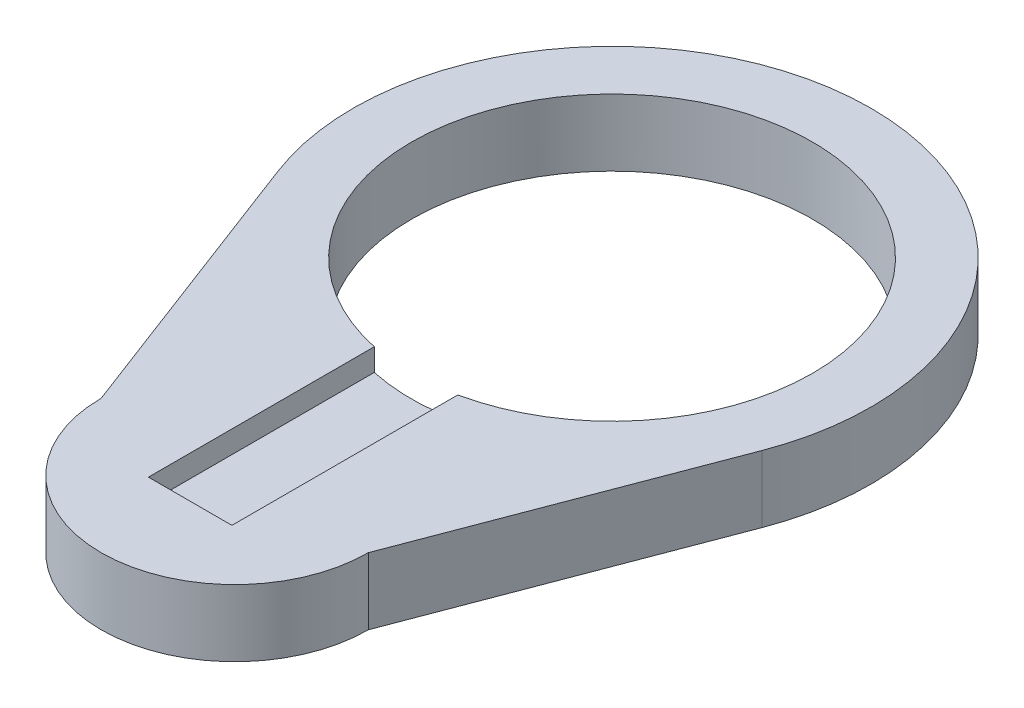
ISO-10303-21;
HEADER;
FILE_DESCRIPTION(('STEP AP214'),'2;1');
FILE_NAME('part.step','',(''),(''),'','','');
FILE_SCHEMA(('AUTOMOTIVE_DESIGN { 1 0 10303 214 1 1 1 1 }'));
ENDSEC;
DATA;
#1=APPLICATION_CONTEXT('core data for automotive mechanical design processes');
#2=APPLICATION_PROTOCOL_DEFINITION('international standard','automotive_design',2000,#1);
#3=PRODUCT_CONTEXT('',#1,'mechanical');
#4=PRODUCT('Part','Part','',(#3));
#5=PRODUCT_RELATED_PRODUCT_CATEGORY('part','',(#4));
#6=PRODUCT_DEFINITION_FORMATION('','',#4);
#7=PRODUCT_DEFINITION_CONTEXT('part definition',#1,'design');
#8=PRODUCT_DEFINITION('design','',#6,#7);
#9=PRODUCT_DEFINITION_SHAPE('','',#8);
#10=(LENGTH_UNIT() NAMED_UNIT(*) SI_UNIT(.MILLI.,.METRE.));
#11=(NAMED_UNIT(*) PLANE_ANGLE_UNIT() SI_UNIT($,.RADIAN.));
#12=(NAMED_UNIT(*) SI_UNIT($,.STERADIAN.) SOLID_ANGLE_UNIT());
#13=UNCERTAINTY_MEASURE_WITH_UNIT(LENGTH_MEASURE(1.E-05),#10,'distance_accuracy_value','');
#14=(GEOMETRIC_REPRESENTATION_CONTEXT(3) GLOBAL_UNCERTAINTY_ASSIGNED_CONTEXT((#13)) GLOBAL_UNIT_ASSIGNED_CONTEXT((#10,
#11,#12)) REPRESENTATION_CONTEXT('',''));
#15=CARTESIAN_POINT('',(0.,0.,0.));
#16=DIRECTION('',(0.,0.,1.));
#17=DIRECTION('',(1.,0.,0.));
#18=AXIS2_PLACEMENT_3D('',#15,#16,#17);
#19=CARTESIAN_POINT('',(0.,6.,-33.89));
#20=DIRECTION('',(0.,1.,0.));
#21=DIRECTION('',(0.,0.,1.));
#22=AXIS2_PLACEMENT_3D('',#19,#20,#21);
#23=PLANE('',#22);
#24=DIRECTION('',(0.,0.,1.));
#25=VECTOR('',#24,1.);
#26=CARTESIAN_POINT('',(-3.75,6.,-17.));
#27=LINE('',#26,#25);
#28=CARTESIAN_POINT('',(-3.75,6.,-16.2849581085418));
#29=VERTEX_POINT('',#28);
#30=CARTESIAN_POINT('',(-3.75,6.,4.));
#31=VERTEX_POINT('',#30);
#32=EDGE_CURVE('E131',#29,#31,#27,.T.);
#33=ORIENTED_EDGE('',*,*,#32,.F.);
#34=CARTESIAN_POINT('',(0.,6.,-33.89));
#35=DIRECTION('',(0.,1.,0.));
#36=DIRECTION('',(0.,0.,1.));
#37=AXIS2_PLACEMENT_3D('',#34,#35,#36);
#38=CIRCLE('',#37,18.);
#39=CARTESIAN_POINT('',(3.75,6.,-16.2849581085418));
#40=VERTEX_POINT('',#39);
#41=EDGE_CURVE('E154',#40,#29,#38,.T.);
#42=ORIENTED_EDGE('',*,*,#41,.F.);
#43=DIRECTION('',(0.,0.,-1.));
#44=VECTOR('',#43,1.);
#45=CARTESIAN_POINT('',(3.75,6.,-17.));
#46=LINE('',#45,#44);
#47=CARTESIAN_POINT('',(3.75,6.,4.));
#48=VERTEX_POINT('',#47);
#49=EDGE_CURVE('E125',#48,#40,#46,.T.);
#50=ORIENTED_EDGE('',*,*,#49,.F.);
#51=DIRECTION('',(1.,0.,0.));
#52=VECTOR('',#51,1.);
#53=CARTESIAN_POINT('',(-3.75,6.,4.));
#54=LINE('',#53,#52);
#55=EDGE_CURVE('E146',#31,#48,#54,.T.);
#56=ORIENTED_EDGE('',*,*,#55,.F.);
#57=EDGE_LOOP('',(#33,#42,#50,#56));
#58=FACE_BOUND('',#57,.T.);
#59=CARTESIAN_POINT('',(0.,6.,-33.89));
#60=DIRECTION('',(0.,1.,0.));
#61=DIRECTION('',(0.,0.,1.));
#62=AXIS2_PLACEMENT_3D('',#59,#60,#61);
#63=CIRCLE('',#62,23.25);
#64=CARTESIAN_POINT('',(21.7354445195078,6.,-25.6357313140777));
#65=VERTEX_POINT('',#64);
#66=CARTESIAN_POINT('',(-21.7354445195078,6.,-25.6357313140777));
#67=VERTEX_POINT('',#66);
#68=EDGE_CURVE('E162',#65,#67,#63,.T.);
#69=ORIENTED_EDGE('',*,*,#68,.T.);
#70=DIRECTION('',(0.355022309071926,0.,0.934857828796036));
#71=VECTOR('',#70,1.);
#72=CARTESIAN_POINT('',(-21.7354445195078,6.,-25.6357313140777));
#73=LINE('',#72,#71);
#74=CARTESIAN_POINT('',(-12.,6.,0.));
#75=VERTEX_POINT('',#74);
#76=EDGE_CURVE('E95',#67,#75,#73,.T.);
#77=ORIENTED_EDGE('',*,*,#76,.T.);
#78=CARTESIAN_POINT('',(0.,6.,0.));
#79=DIRECTION('',(0.,1.,0.));
#80=DIRECTION('',(0.,0.,1.));
#81=AXIS2_PLACEMENT_3D('',#78,#79,#80);
#82=CIRCLE('',#81,12.);
#83=CARTESIAN_POINT('',(12.,6.,0.));
#84=VERTEX_POINT('',#83);
#85=EDGE_CURVE('E167',#75,#84,#82,.T.);
#86=ORIENTED_EDGE('',*,*,#85,.T.);
#87=DIRECTION('',(0.355022309071925,0.,-0.934857828796036));
#88=VECTOR('',#87,1.);
#89=CARTESIAN_POINT('',(21.7354445195078,6.,-25.6357313140777));
#90=LINE('',#89,#88);
#91=EDGE_CURVE('E66',#84,#65,#90,.T.);
#92=ORIENTED_EDGE('',*,*,#91,.T.);
#93=EDGE_LOOP('',(#69,#77,#86,#92));
#94=FACE_BOUND('',#93,.T.);
#95=ADVANCED_FACE('F41',(#58,#94),#23,.T.);
#96=CARTESIAN_POINT('',(0.,0.,-33.89));
#97=DIRECTION('',(0.,1.,0.));
#98=DIRECTION('',(0.,0.,1.));
#99=AXIS2_PLACEMENT_3D('',#96,#97,#98);
#100=PLANE('',#99);
#101=CARTESIAN_POINT('',(0.,0.,-33.89));
#102=DIRECTION('',(0.,1.,0.));
#103=DIRECTION('',(0.,0.,1.));
#104=AXIS2_PLACEMENT_3D('',#101,#102,#103);
#105=CIRCLE('',#104,23.25);
#106=CARTESIAN_POINT('',(21.7354445195078,0.,-25.6357313140777));
#107=VERTEX_POINT('',#106);
#108=CARTESIAN_POINT('',(-21.7354445195078,0.,-25.6357313140777));
#109=VERTEX_POINT('',#108);
#110=EDGE_CURVE('E158',#107,#109,#105,.T.);
#111=ORIENTED_EDGE('',*,*,#110,.F.);
#112=DIRECTION('',(0.355022309071925,0.,-0.934857828796036));
#113=VECTOR('',#112,1.);
#114=CARTESIAN_POINT('',(21.7354445195078,0.,-25.6357313140777));
#115=LINE('',#114,#113);
#116=CARTESIAN_POINT('',(12.,0.,0.));
#117=VERTEX_POINT('',#116);
#118=EDGE_CURVE('E87',#117,#107,#115,.T.);
#119=ORIENTED_EDGE('',*,*,#118,.F.);
#120=CARTESIAN_POINT('',(0.,0.,0.));
#121=DIRECTION('',(0.,1.,0.));
#122=DIRECTION('',(0.,0.,1.));
#123=AXIS2_PLACEMENT_3D('',#120,#121,#122);
#124=CIRCLE('',#123,12.);
#125=CARTESIAN_POINT('',(-12.,0.,0.));
#126=VERTEX_POINT('',#125);
#127=EDGE_CURVE('E179',#126,#117,#124,.T.);
#128=ORIENTED_EDGE('',*,*,#127,.F.);
#129=DIRECTION('',(0.355022309071926,0.,0.934857828796036));
#130=VECTOR('',#129,1.);
#131=CARTESIAN_POINT('',(-21.7354445195078,0.,-25.6357313140777));
#132=LINE('',#131,#130);
#133=EDGE_CURVE('E176',#109,#126,#132,.T.);
#134=ORIENTED_EDGE('',*,*,#133,.F.);
#135=EDGE_LOOP('',(#111,#119,#128,#134));
#136=FACE_BOUND('',#135,.T.);
#137=CARTESIAN_POINT('',(0.,0.,-33.89));
#138=DIRECTION('',(0.,1.,0.));
#139=DIRECTION('',(0.,0.,1.));
#140=AXIS2_PLACEMENT_3D('',#137,#138,#139);
#141=CIRCLE('',#140,18.);
#142=CARTESIAN_POINT('',(0.,0.,-15.89));
#143=VERTEX_POINT('',#142);
#144=EDGE_CURVE('E152',#143,#143,#141,.T.);
#145=ORIENTED_EDGE('',*,*,#144,.T.);
#146=EDGE_LOOP('',(#145));
#147=FACE_BOUND('',#146,.T.);
#148=ADVANCED_FACE('F208',(#136,#147),#100,.F.);
#149=CARTESIAN_POINT('',(0.,6.,-33.89));
#150=DIRECTION('',(0.,-1.,0.));
#151=DIRECTION('',(0.,0.,-1.));
#152=AXIS2_PLACEMENT_3D('',#149,#150,#151);
#153=CYLINDRICAL_SURFACE('',#152,23.25);
#154=ORIENTED_EDGE('',*,*,#110,.T.);
#155=DIRECTION('',(0.,-1.,0.));
#156=VECTOR('',#155,1.);
#157=CARTESIAN_POINT('',(-21.7354445195078,6.,-25.6357313140777));
#158=LINE('',#157,#156);
#159=EDGE_CURVE('E193',#67,#109,#158,.T.);
#160=ORIENTED_EDGE('',*,*,#159,.F.);
#161=ORIENTED_EDGE('',*,*,#68,.F.);
#162=DIRECTION('',(0.,-1.,0.));
#163=VECTOR('',#162,1.);
#164=CARTESIAN_POINT('',(21.7354445195078,6.,-25.6357313140777));
#165=LINE('',#164,#163);
#166=EDGE_CURVE('E172',#65,#107,#165,.T.);
#167=ORIENTED_EDGE('',*,*,#166,.T.);
#168=EDGE_LOOP('',(#154,#160,#161,#167));
#169=FACE_BOUND('',#168,.T.);
#170=ADVANCED_FACE('F43',(#169),#153,.T.);
#171=CARTESIAN_POINT('',(-21.7354445195078,6.,-25.6357313140777));
#172=DIRECTION('',(0.934857828796036,0.,-0.355022309071926));
#173=DIRECTION('',(-0.355022309071926,0.,-0.934857828796036));
#174=AXIS2_PLACEMENT_3D('',#171,#172,#173);
#175=PLANE('',#174);
#176=ORIENTED_EDGE('',*,*,#133,.T.);
#177=DIRECTION('',(0.,-1.,0.));
#178=VECTOR('',#177,1.);
#179=CARTESIAN_POINT('',(-12.,6.,0.));
#180=LINE('',#179,#178);
#181=EDGE_CURVE('E189',#75,#126,#180,.T.);
#182=ORIENTED_EDGE('',*,*,#181,.F.);
#183=ORIENTED_EDGE('',*,*,#76,.F.);
#184=ORIENTED_EDGE('',*,*,#159,.T.);
#185=EDGE_LOOP('',(#176,#182,#183,#184));
#186=FACE_BOUND('',#185,.T.);
#187=ADVANCED_FACE('F214',(#186),#175,.F.);
#188=CARTESIAN_POINT('',(0.,6.,0.));
#189=DIRECTION('',(0.,-1.,0.));
#190=DIRECTION('',(0.,0.,-1.));
#191=AXIS2_PLACEMENT_3D('',#188,#189,#190);
#192=CYLINDRICAL_SURFACE('',#191,12.);
#193=ORIENTED_EDGE('',*,*,#127,.T.);
#194=DIRECTION('',(0.,-1.,0.));
#195=VECTOR('',#194,1.);
#196=CARTESIAN_POINT('',(12.,6.,0.));
#197=LINE('',#196,#195);
#198=EDGE_CURVE('E186',#84,#117,#197,.T.);
#199=ORIENTED_EDGE('',*,*,#198,.F.);
#200=ORIENTED_EDGE('',*,*,#85,.F.);
#201=ORIENTED_EDGE('',*,*,#181,.T.);
#202=EDGE_LOOP('',(#193,#199,#200,#201));
#203=FACE_BOUND('',#202,.T.);
#204=ADVANCED_FACE('F219',(#203),#192,.T.);
#205=CARTESIAN_POINT('',(21.7354445195078,6.,-25.6357313140777));
#206=DIRECTION('',(-0.934857828796036,0.,-0.355022309071925));
#207=DIRECTION('',(-0.355022309071925,0.,0.934857828796036));
#208=AXIS2_PLACEMENT_3D('',#205,#206,#207);
#209=PLANE('',#208);
#210=ORIENTED_EDGE('',*,*,#118,.T.);
#211=ORIENTED_EDGE('',*,*,#166,.F.);
#212=ORIENTED_EDGE('',*,*,#91,.F.);
#213=ORIENTED_EDGE('',*,*,#198,.T.);
#214=EDGE_LOOP('',(#210,#211,#212,#213));
#215=FACE_BOUND('',#214,.T.);
#216=ADVANCED_FACE('F226',(#215),#209,.F.);
#217=CARTESIAN_POINT('',(0.,6.,-33.89));
#218=DIRECTION('',(0.,-1.,0.));
#219=DIRECTION('',(0.,0.,-1.));
#220=AXIS2_PLACEMENT_3D('',#217,#218,#219);
#221=CYLINDRICAL_SURFACE('',#220,18.);
#222=DIRECTION('',(0.,-1.,0.));
#223=VECTOR('',#222,1.);
#224=CARTESIAN_POINT('',(-3.75,6.,-16.2849581085418));
#225=LINE('',#224,#223);
#226=CARTESIAN_POINT('',(-3.75,4.,-16.2849581085418));
#227=VERTEX_POINT('',#226);
#228=EDGE_CURVE('E11',#227,#29,#225,.F.);
#229=ORIENTED_EDGE('',*,*,#228,.F.);
#230=CARTESIAN_POINT('',(0.,4.,-33.89));
#231=DIRECTION('',(0.,1.,0.));
#232=DIRECTION('',(0.,0.,1.));
#233=AXIS2_PLACEMENT_3D('',#230,#231,#232);
#234=CIRCLE('',#233,18.);
#235=CARTESIAN_POINT('',(3.75,4.,-16.2849581085418));
#236=VERTEX_POINT('',#235);
#237=EDGE_CURVE('E121',#227,#236,#234,.T.);
#238=ORIENTED_EDGE('',*,*,#237,.T.);
#239=DIRECTION('',(0.,-1.,0.));
#240=VECTOR('',#239,1.);
#241=CARTESIAN_POINT('',(3.75,6.,-16.2849581085417));
#242=LINE('',#241,#240);
#243=EDGE_CURVE('E50',#40,#236,#242,.T.);
#244=ORIENTED_EDGE('',*,*,#243,.F.);
#245=ORIENTED_EDGE('',*,*,#41,.T.);
#246=EDGE_LOOP('',(#229,#238,#244,#245));
#247=FACE_BOUND('',#246,.T.);
#248=ORIENTED_EDGE('',*,*,#144,.F.);
#249=EDGE_LOOP('',(#248));
#250=FACE_BOUND('',#249,.T.);
#251=ADVANCED_FACE('F204',(#247,#250),#221,.F.);
#252=CARTESIAN_POINT('',(-3.75,4.,-17.));
#253=DIRECTION('',(-1.,0.,0.));
#254=DIRECTION('',(0.,0.,1.));
#255=AXIS2_PLACEMENT_3D('',#252,#253,#254);
#256=PLANE('',#255);
#257=ORIENTED_EDGE('',*,*,#228,.T.);
#258=ORIENTED_EDGE('',*,*,#32,.T.);
#259=DIRECTION('',(0.,1.,0.));
#260=VECTOR('',#259,1.);
#261=CARTESIAN_POINT('',(-3.75,4.,4.));
#262=LINE('',#261,#260);
#263=CARTESIAN_POINT('',(-3.75,4.,4.));
#264=VERTEX_POINT('',#263);
#265=EDGE_CURVE('E128',#264,#31,#262,.T.);
#266=ORIENTED_EDGE('',*,*,#265,.F.);
#267=DIRECTION('',(0.,0.,1.));
#268=VECTOR('',#267,1.);
#269=CARTESIAN_POINT('',(-3.75,4.,-17.));
#270=LINE('',#269,#268);
#271=EDGE_CURVE('E115',#227,#264,#270,.T.);
#272=ORIENTED_EDGE('',*,*,#271,.F.);
#273=EDGE_LOOP('',(#257,#258,#266,#272));
#274=FACE_BOUND('',#273,.T.);
#275=ADVANCED_FACE('F129',(#274),#256,.F.);
#276=CARTESIAN_POINT('',(3.75,4.,-17.));
#277=DIRECTION('',(1.,0.,0.));
#278=DIRECTION('',(0.,0.,-1.));
#279=AXIS2_PLACEMENT_3D('',#276,#277,#278);
#280=PLANE('',#279);
#281=ORIENTED_EDGE('',*,*,#243,.T.);
#282=DIRECTION('',(0.,0.,-1.));
#283=VECTOR('',#282,1.);
#284=CARTESIAN_POINT('',(3.75,4.,-17.));
#285=LINE('',#284,#283);
#286=CARTESIAN_POINT('',(3.75,4.,4.));
#287=VERTEX_POINT('',#286);
#288=EDGE_CURVE('E57',#287,#236,#285,.T.);
#289=ORIENTED_EDGE('',*,*,#288,.F.);
#290=DIRECTION('',(0.,1.,0.));
#291=VECTOR('',#290,1.);
#292=CARTESIAN_POINT('',(3.75,4.,4.));
#293=LINE('',#292,#291);
#294=EDGE_CURVE('E136',#287,#48,#293,.T.);
#295=ORIENTED_EDGE('',*,*,#294,.T.);
#296=ORIENTED_EDGE('',*,*,#49,.T.);
#297=EDGE_LOOP('',(#281,#289,#295,#296));
#298=FACE_BOUND('',#297,.T.);
#299=ADVANCED_FACE('F200',(#298),#280,.F.);
#300=CARTESIAN_POINT('',(-3.75,4.,4.));
#301=DIRECTION('',(0.,0.,1.));
#302=DIRECTION('',(1.,0.,0.));
#303=AXIS2_PLACEMENT_3D('',#300,#301,#302);
#304=PLANE('',#303);
#305=ORIENTED_EDGE('',*,*,#55,.T.);
#306=ORIENTED_EDGE('',*,*,#294,.F.);
#307=DIRECTION('',(1.,0.,0.));
#308=VECTOR('',#307,1.);
#309=CARTESIAN_POINT('',(-3.75,4.,4.));
#310=LINE('',#309,#308);
#311=EDGE_CURVE('E119',#264,#287,#310,.T.);
#312=ORIENTED_EDGE('',*,*,#311,.F.);
#313=ORIENTED_EDGE('',*,*,#265,.T.);
#314=EDGE_LOOP('',(#305,#306,#312,#313));
#315=FACE_BOUND('',#314,.T.);
#316=ADVANCED_FACE('F138',(#315),#304,.F.);
#317=CARTESIAN_POINT('',(0.,4.,0.));
#318=DIRECTION('',(0.,1.,0.));
#319=DIRECTION('',(0.,0.,1.));
#320=AXIS2_PLACEMENT_3D('',#317,#318,#319);
#321=PLANE('',#320);
#322=ORIENTED_EDGE('',*,*,#271,.T.);
#323=ORIENTED_EDGE('',*,*,#311,.T.);
#324=ORIENTED_EDGE('',*,*,#288,.T.);
#325=ORIENTED_EDGE('',*,*,#237,.F.);
#326=EDGE_LOOP('',(#322,#323,#324,#325));
#327=FACE_BOUND('',#326,.T.);
#328=ADVANCED_FACE('F117',(#327),#321,.T.);
#329=CLOSED_SHELL('',(#95,#148,#170,#187,#204,#216,#251,#275,#299,#316,#328));
#330=MANIFOLD_SOLID_BREP('B2',#329);
#331=ADVANCED_BREP_SHAPE_REPRESENTATION('',(#18,#330),#14);
#332=SHAPE_DEFINITION_REPRESENTATION(#9,#331);
ENDSEC;
END-ISO-10303-21;
